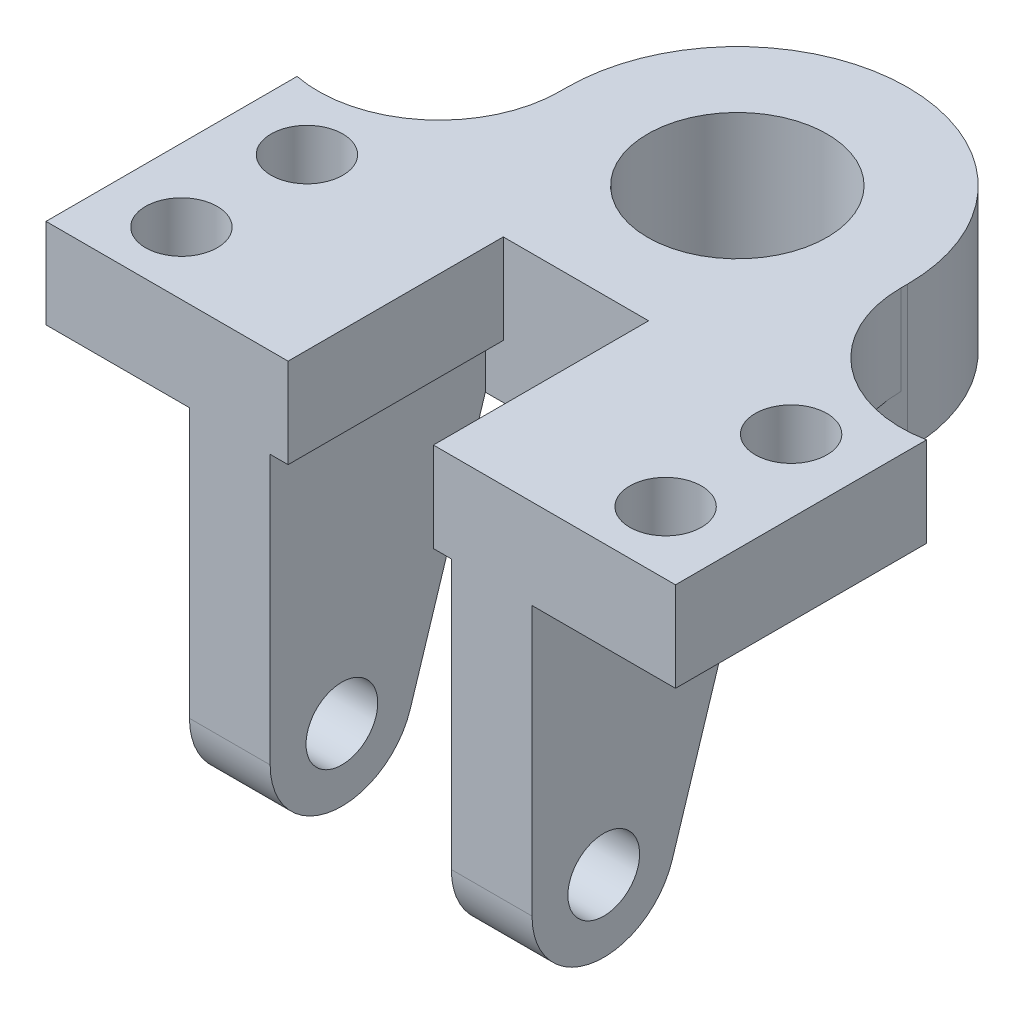
ISO-10303-21;
HEADER;
FILE_DESCRIPTION(('STEP AP214'),'2;1');
FILE_NAME('part.step','',(''),(''),'','','');
FILE_SCHEMA(('AUTOMOTIVE_DESIGN { 1 0 10303 214 1 1 1 1 }'));
ENDSEC;
DATA;
#1=APPLICATION_CONTEXT('core data for automotive mechanical design processes');
#2=APPLICATION_PROTOCOL_DEFINITION('international standard','automotive_design',2000,#1);
#3=PRODUCT_CONTEXT('',#1,'mechanical');
#4=PRODUCT('Part','Part','',(#3));
#5=PRODUCT_RELATED_PRODUCT_CATEGORY('part','',(#4));
#6=PRODUCT_DEFINITION_FORMATION('','',#4);
#7=PRODUCT_DEFINITION_CONTEXT('part definition',#1,'design');
#8=PRODUCT_DEFINITION('design','',#6,#7);
#9=PRODUCT_DEFINITION_SHAPE('','',#8);
#10=(LENGTH_UNIT() NAMED_UNIT(*) SI_UNIT(.MILLI.,.METRE.));
#11=(NAMED_UNIT(*) PLANE_ANGLE_UNIT() SI_UNIT($,.RADIAN.));
#12=(NAMED_UNIT(*) SI_UNIT($,.STERADIAN.) SOLID_ANGLE_UNIT());
#13=UNCERTAINTY_MEASURE_WITH_UNIT(LENGTH_MEASURE(1.E-05),#10,'distance_accuracy_value','');
#14=(GEOMETRIC_REPRESENTATION_CONTEXT(3) GLOBAL_UNCERTAINTY_ASSIGNED_CONTEXT((#13)) GLOBAL_UNIT_ASSIGNED_CONTEXT((#10,
#11,#12)) REPRESENTATION_CONTEXT('',''));
#15=CARTESIAN_POINT('',(0.,0.,0.));
#16=DIRECTION('',(0.,0.,1.));
#17=DIRECTION('',(1.,0.,0.));
#18=AXIS2_PLACEMENT_3D('',#15,#16,#17);
#19=CARTESIAN_POINT('',(-38.,32.,36.));
#20=DIRECTION('',(0.,0.,-1.));
#21=DIRECTION('',(-1.,0.,0.));
#22=AXIS2_PLACEMENT_3D('',#19,#20,#21);
#23=PLANE('',#22);
#24=DIRECTION('',(0.,-1.,0.));
#25=VECTOR('',#24,1.);
#26=CARTESIAN_POINT('',(-20.2057850301413,12.,36.));
#27=LINE('',#26,#25);
#28=CARTESIAN_POINT('',(-20.2057850301413,12.,36.));
#29=VERTEX_POINT('',#28);
#30=CARTESIAN_POINT('',(-20.2057850301413,0.,36.));
#31=VERTEX_POINT('',#30);
#32=EDGE_CURVE('E455',#29,#31,#27,.T.);
#33=ORIENTED_EDGE('',*,*,#32,.T.);
#34=DIRECTION('',(1.,0.,0.));
#35=VECTOR('',#34,1.);
#36=CARTESIAN_POINT('',(-38.,0.,36.));
#37=LINE('',#36,#35);
#38=CARTESIAN_POINT('',(20.2057850301413,0.,36.));
#39=VERTEX_POINT('',#38);
#40=EDGE_CURVE('E56',#31,#39,#37,.T.);
#41=ORIENTED_EDGE('',*,*,#40,.T.);
#42=DIRECTION('',(0.,-1.,0.));
#43=VECTOR('',#42,1.);
#44=CARTESIAN_POINT('',(20.2057850301413,12.,36.));
#45=LINE('',#44,#43);
#46=CARTESIAN_POINT('',(20.2057850301413,12.,36.));
#47=VERTEX_POINT('',#46);
#48=EDGE_CURVE('E235',#47,#39,#45,.T.);
#49=ORIENTED_EDGE('',*,*,#48,.F.);
#50=DIRECTION('',(1.,0.,0.));
#51=VECTOR('',#50,1.);
#52=CARTESIAN_POINT('',(38.,12.,36.));
#53=LINE('',#52,#51);
#54=CARTESIAN_POINT('',(16.2057850301413,12.,36.));
#55=VERTEX_POINT('',#54);
#56=EDGE_CURVE('E297',#55,#47,#53,.T.);
#57=ORIENTED_EDGE('',*,*,#56,.F.);
#58=DIRECTION('',(0.,1.,0.));
#59=VECTOR('',#58,1.);
#60=CARTESIAN_POINT('',(16.2057850301413,12.,36.));
#61=LINE('',#60,#59);
#62=CARTESIAN_POINT('',(16.2057850301413,32.,36.));
#63=VERTEX_POINT('',#62);
#64=EDGE_CURVE('E328',#55,#63,#61,.T.);
#65=ORIENTED_EDGE('',*,*,#64,.T.);
#66=DIRECTION('',(1.,0.,0.));
#67=VECTOR('',#66,1.);
#68=CARTESIAN_POINT('',(-38.,32.,36.));
#69=LINE('',#68,#67);
#70=CARTESIAN_POINT('',(-16.2057850301413,32.,36.));
#71=VERTEX_POINT('',#70);
#72=EDGE_CURVE('E397',#71,#63,#69,.T.);
#73=ORIENTED_EDGE('',*,*,#72,.F.);
#74=DIRECTION('',(0.,1.,0.));
#75=VECTOR('',#74,1.);
#76=CARTESIAN_POINT('',(-16.2057850301413,12.,36.));
#77=LINE('',#76,#75);
#78=CARTESIAN_POINT('',(-16.2057850301413,12.,36.));
#79=VERTEX_POINT('',#78);
#80=EDGE_CURVE('E375',#79,#71,#77,.T.);
#81=ORIENTED_EDGE('',*,*,#80,.F.);
#82=DIRECTION('',(-1.,0.,0.));
#83=VECTOR('',#82,1.);
#84=CARTESIAN_POINT('',(-38.,12.,36.));
#85=LINE('',#84,#83);
#86=EDGE_CURVE('E357',#79,#29,#85,.T.);
#87=ORIENTED_EDGE('',*,*,#86,.T.);
#88=EDGE_LOOP('',(#33,#41,#49,#57,#65,#73,#81,#87));
#89=FACE_BOUND('',#88,.T.);
#90=ADVANCED_FACE('F33',(#89),#23,.F.);
#91=CARTESIAN_POINT('',(-64.9900933310246,12.,1.51865377067885));
#92=DIRECTION('',(0.,1.,0.));
#93=DIRECTION('',(0.,0.,1.));
#94=AXIS2_PLACEMENT_3D('',#91,#92,#93);
#95=PLANE('',#94);
#96=DIRECTION('',(0.,0.,-1.));
#97=VECTOR('',#96,1.);
#98=CARTESIAN_POINT('',(-20.2057850301413,12.,36.));
#99=LINE('',#98,#97);
#100=CARTESIAN_POINT('',(-20.2057850301413,12.,84.));
#101=VERTEX_POINT('',#100);
#102=EDGE_CURVE('E48',#101,#29,#99,.T.);
#103=ORIENTED_EDGE('',*,*,#102,.T.);
#104=ORIENTED_EDGE('',*,*,#86,.F.);
#105=DIRECTION('',(0.,0.,-1.));
#106=VECTOR('',#105,1.);
#107=CARTESIAN_POINT('',(-16.2057850301413,12.,84.));
#108=LINE('',#107,#106);
#109=CARTESIAN_POINT('',(-16.2057850301413,12.,84.));
#110=VERTEX_POINT('',#109);
#111=EDGE_CURVE('E354',#110,#79,#108,.T.);
#112=ORIENTED_EDGE('',*,*,#111,.F.);
#113=DIRECTION('',(1.,0.,0.));
#114=VECTOR('',#113,1.);
#115=CARTESIAN_POINT('',(-38.2057850301413,12.,84.));
#116=LINE('',#115,#114);
#117=EDGE_CURVE('E351',#101,#110,#116,.T.);
#118=ORIENTED_EDGE('',*,*,#117,.F.);
#119=EDGE_LOOP('',(#103,#104,#112,#118));
#120=FACE_BOUND('',#119,.T.);
#121=ADVANCED_FACE('F457',(#120),#95,.F.);
#122=CARTESIAN_POINT('',(64.9900933310246,12.,1.51865377067885));
#123=DIRECTION('',(0.,1.,0.));
#124=DIRECTION('',(0.,0.,1.));
#125=AXIS2_PLACEMENT_3D('',#122,#123,#124);
#126=PLANE('',#125);
#127=DIRECTION('',(0.,0.,-1.));
#128=VECTOR('',#127,1.);
#129=CARTESIAN_POINT('',(20.2057850301413,12.,36.));
#130=LINE('',#129,#128);
#131=CARTESIAN_POINT('',(20.2057850301413,12.,84.));
#132=VERTEX_POINT('',#131);
#133=EDGE_CURVE('E243',#132,#47,#130,.T.);
#134=ORIENTED_EDGE('',*,*,#133,.F.);
#135=DIRECTION('',(-1.,0.,0.));
#136=VECTOR('',#135,1.);
#137=CARTESIAN_POINT('',(16.2057850301413,12.,84.));
#138=LINE('',#137,#136);
#139=CARTESIAN_POINT('',(16.2057850301413,12.,84.));
#140=VERTEX_POINT('',#139);
#141=EDGE_CURVE('E303',#132,#140,#138,.T.);
#142=ORIENTED_EDGE('',*,*,#141,.T.);
#143=DIRECTION('',(0.,0.,-1.));
#144=VECTOR('',#143,1.);
#145=CARTESIAN_POINT('',(16.2057850301413,12.,84.));
#146=LINE('',#145,#144);
#147=EDGE_CURVE('E300',#140,#55,#146,.T.);
#148=ORIENTED_EDGE('',*,*,#147,.T.);
#149=ORIENTED_EDGE('',*,*,#56,.T.);
#150=EDGE_LOOP('',(#134,#142,#148,#149));
#151=FACE_BOUND('',#150,.T.);
#152=ADVANCED_FACE('F437',(#151),#126,.F.);
#153=CARTESIAN_POINT('',(38.,32.,0.));
#154=DIRECTION('',(-1.,0.,0.));
#155=DIRECTION('',(0.,0.,1.));
#156=AXIS2_PLACEMENT_3D('',#153,#154,#155);
#157=PLANE('',#156);
#158=DIRECTION('',(0.,0.,-1.));
#159=VECTOR('',#158,1.);
#160=CARTESIAN_POINT('',(38.,12.,1.51865377067885));
#161=LINE('',#160,#159);
#162=CARTESIAN_POINT('',(38.,12.,36.));
#163=VERTEX_POINT('',#162);
#164=CARTESIAN_POINT('',(38.,12.,1.51865377067885));
#165=VERTEX_POINT('',#164);
#166=EDGE_CURVE('E293',#163,#165,#161,.T.);
#167=ORIENTED_EDGE('',*,*,#166,.F.);
#168=DIRECTION('',(0.,-1.,0.));
#169=VECTOR('',#168,1.);
#170=CARTESIAN_POINT('',(38.,32.,36.));
#171=LINE('',#170,#169);
#172=CARTESIAN_POINT('',(38.,0.,36.));
#173=VERTEX_POINT('',#172);
#174=EDGE_CURVE('E413',#163,#173,#171,.T.);
#175=ORIENTED_EDGE('',*,*,#174,.T.);
#176=DIRECTION('',(0.,0.,-1.));
#177=VECTOR('',#176,1.);
#178=CARTESIAN_POINT('',(38.,0.,0.));
#179=LINE('',#178,#177);
#180=CARTESIAN_POINT('',(38.,0.,0.));
#181=VERTEX_POINT('',#180);
#182=EDGE_CURVE('E394',#173,#181,#179,.T.);
#183=ORIENTED_EDGE('',*,*,#182,.T.);
#184=DIRECTION('',(0.,-1.,0.));
#185=VECTOR('',#184,1.);
#186=CARTESIAN_POINT('',(38.,32.,0.));
#187=LINE('',#186,#185);
#188=CARTESIAN_POINT('',(38.,32.,0.));
#189=VERTEX_POINT('',#188);
#190=EDGE_CURVE('E402',#189,#181,#187,.T.);
#191=ORIENTED_EDGE('',*,*,#190,.F.);
#192=DIRECTION('',(0.,0.,-1.));
#193=VECTOR('',#192,1.);
#194=CARTESIAN_POINT('',(38.,32.,0.));
#195=LINE('',#194,#193);
#196=CARTESIAN_POINT('',(38.,32.,1.51865377067885));
#197=VERTEX_POINT('',#196);
#198=EDGE_CURVE('E400',#197,#189,#195,.T.);
#199=ORIENTED_EDGE('',*,*,#198,.F.);
#200=DIRECTION('',(0.,1.,0.));
#201=VECTOR('',#200,1.);
#202=CARTESIAN_POINT('',(38.,12.,1.51865377067885));
#203=LINE('',#202,#201);
#204=EDGE_CURVE('E309',#165,#197,#203,.T.);
#205=ORIENTED_EDGE('',*,*,#204,.F.);
#206=EDGE_LOOP('',(#167,#175,#183,#191,#199,#205));
#207=FACE_BOUND('',#206,.T.);
#208=ADVANCED_FACE('F505',(#207),#157,.F.);
#209=CARTESIAN_POINT('',(-38.,32.,36.));
#210=DIRECTION('',(1.,0.,0.));
#211=DIRECTION('',(0.,0.,-1.));
#212=AXIS2_PLACEMENT_3D('',#209,#210,#211);
#213=PLANE('',#212);
#214=DIRECTION('',(0.,1.,0.));
#215=VECTOR('',#214,1.);
#216=CARTESIAN_POINT('',(-38.,12.,1.51865377067885));
#217=LINE('',#216,#215);
#218=CARTESIAN_POINT('',(-38.,12.,1.51865377067885));
#219=VERTEX_POINT('',#218);
#220=CARTESIAN_POINT('',(-38.,32.,1.51865377067885));
#221=VERTEX_POINT('',#220);
#222=EDGE_CURVE('E371',#219,#221,#217,.T.);
#223=ORIENTED_EDGE('',*,*,#222,.T.);
#224=DIRECTION('',(0.,0.,1.));
#225=VECTOR('',#224,1.);
#226=CARTESIAN_POINT('',(-38.,32.,36.));
#227=LINE('',#226,#225);
#228=CARTESIAN_POINT('',(-38.,32.,0.));
#229=VERTEX_POINT('',#228);
#230=EDGE_CURVE('E393',#229,#221,#227,.T.);
#231=ORIENTED_EDGE('',*,*,#230,.F.);
#232=DIRECTION('',(0.,-1.,0.));
#233=VECTOR('',#232,1.);
#234=CARTESIAN_POINT('',(-38.,32.,0.));
#235=LINE('',#234,#233);
#236=CARTESIAN_POINT('',(-38.,0.,0.));
#237=VERTEX_POINT('',#236);
#238=EDGE_CURVE('E11',#229,#237,#235,.T.);
#239=ORIENTED_EDGE('',*,*,#238,.T.);
#240=DIRECTION('',(0.,0.,1.));
#241=VECTOR('',#240,1.);
#242=CARTESIAN_POINT('',(-38.,0.,36.));
#243=LINE('',#242,#241);
#244=CARTESIAN_POINT('',(-38.,0.,36.));
#245=VERTEX_POINT('',#244);
#246=EDGE_CURVE('E405',#237,#245,#243,.T.);
#247=ORIENTED_EDGE('',*,*,#246,.T.);
#248=DIRECTION('',(0.,-1.,0.));
#249=VECTOR('',#248,1.);
#250=CARTESIAN_POINT('',(-38.,32.,36.));
#251=LINE('',#250,#249);
#252=CARTESIAN_POINT('',(-38.,12.,36.));
#253=VERTEX_POINT('',#252);
#254=EDGE_CURVE('E41',#253,#245,#251,.T.);
#255=ORIENTED_EDGE('',*,*,#254,.F.);
#256=DIRECTION('',(0.,0.,-1.));
#257=VECTOR('',#256,1.);
#258=CARTESIAN_POINT('',(-38.,12.,1.51865377067885));
#259=LINE('',#258,#257);
#260=EDGE_CURVE('E220',#253,#219,#259,.T.);
#261=ORIENTED_EDGE('',*,*,#260,.T.);
#262=EDGE_LOOP('',(#223,#231,#239,#247,#255,#261));
#263=FACE_BOUND('',#262,.T.);
#264=ADVANCED_FACE('F421',(#263),#213,.F.);
#265=CARTESIAN_POINT('',(0.,32.,0.));
#266=DIRECTION('',(0.,1.,0.));
#267=DIRECTION('',(0.,0.,1.));
#268=AXIS2_PLACEMENT_3D('',#265,#266,#267);
#269=PLANE('',#268);
#270=ORIENTED_EDGE('',*,*,#230,.T.);
#271=CARTESIAN_POINT('',(-64.9900933310246,32.,1.51865377067885));
#272=DIRECTION('',(0.,-1.,0.));
#273=DIRECTION('',(0.,0.,1.));
#274=AXIS2_PLACEMENT_3D('',#271,#272,#273);
#275=CIRCLE('',#274,26.9900933310246);
#276=CARTESIAN_POINT('',(-70.2057850301414,32.,28.));
#277=VERTEX_POINT('',#276);
#278=EDGE_CURVE('E341',#221,#277,#275,.T.);
#279=ORIENTED_EDGE('',*,*,#278,.T.);
#280=DIRECTION('',(0.,0.,1.));
#281=VECTOR('',#280,1.);
#282=CARTESIAN_POINT('',(-70.2057850301414,32.,84.));
#283=LINE('',#282,#281);
#284=CARTESIAN_POINT('',(-70.2057850301414,32.,84.));
#285=VERTEX_POINT('',#284);
#286=EDGE_CURVE('E364',#277,#285,#283,.T.);
#287=ORIENTED_EDGE('',*,*,#286,.T.);
#288=DIRECTION('',(1.,0.,0.));
#289=VECTOR('',#288,1.);
#290=CARTESIAN_POINT('',(-16.2057850301413,32.,84.));
#291=LINE('',#290,#289);
#292=CARTESIAN_POINT('',(-16.2057850301413,32.,84.));
#293=VERTEX_POINT('',#292);
#294=EDGE_CURVE('E367',#285,#293,#291,.T.);
#295=ORIENTED_EDGE('',*,*,#294,.T.);
#296=DIRECTION('',(0.,0.,-1.));
#297=VECTOR('',#296,1.);
#298=CARTESIAN_POINT('',(-16.2057850301413,32.,84.));
#299=LINE('',#298,#297);
#300=EDGE_CURVE('E348',#293,#71,#299,.T.);
#301=ORIENTED_EDGE('',*,*,#300,.T.);
#302=ORIENTED_EDGE('',*,*,#72,.T.);
#303=DIRECTION('',(0.,0.,-1.));
#304=VECTOR('',#303,1.);
#305=CARTESIAN_POINT('',(16.2057850301413,32.,84.));
#306=LINE('',#305,#304);
#307=CARTESIAN_POINT('',(16.2057850301413,32.,84.));
#308=VERTEX_POINT('',#307);
#309=EDGE_CURVE('E312',#308,#63,#306,.T.);
#310=ORIENTED_EDGE('',*,*,#309,.F.);
#311=DIRECTION('',(-1.,0.,0.));
#312=VECTOR('',#311,1.);
#313=CARTESIAN_POINT('',(38.2057850301413,32.,84.));
#314=LINE('',#313,#312);
#315=CARTESIAN_POINT('',(70.2057850301414,32.,84.));
#316=VERTEX_POINT('',#315);
#317=EDGE_CURVE('E315',#316,#308,#314,.T.);
#318=ORIENTED_EDGE('',*,*,#317,.F.);
#319=DIRECTION('',(0.,0.,1.));
#320=VECTOR('',#319,1.);
#321=CARTESIAN_POINT('',(70.2057850301414,32.,84.));
#322=LINE('',#321,#320);
#323=CARTESIAN_POINT('',(70.2057850301414,32.,28.));
#324=VERTEX_POINT('',#323);
#325=EDGE_CURVE('E294',#324,#316,#322,.T.);
#326=ORIENTED_EDGE('',*,*,#325,.F.);
#327=CARTESIAN_POINT('',(64.9900933310246,32.,1.51865377067885));
#328=DIRECTION('',(0.,1.,0.));
#329=DIRECTION('',(0.,0.,1.));
#330=AXIS2_PLACEMENT_3D('',#327,#328,#329);
#331=CIRCLE('',#330,26.9900933310246);
#332=EDGE_CURVE('E287',#197,#324,#331,.T.);
#333=ORIENTED_EDGE('',*,*,#332,.F.);
#334=ORIENTED_EDGE('',*,*,#198,.T.);
#335=CARTESIAN_POINT('',(0.,32.,0.));
#336=DIRECTION('',(0.,1.,0.));
#337=DIRECTION('',(0.,0.,1.));
#338=AXIS2_PLACEMENT_3D('',#335,#336,#337);
#339=CIRCLE('',#338,38.);
#340=EDGE_CURVE('E390',#189,#229,#339,.T.);
#341=ORIENTED_EDGE('',*,*,#340,.T.);
#342=EDGE_LOOP('',(#270,#279,#287,#295,#301,#302,#310,#318,#326,#333,#334,#341));
#343=FACE_BOUND('',#342,.T.);
#344=CARTESIAN_POINT('',(0.,32.,0.));
#345=DIRECTION('',(0.,1.,0.));
#346=DIRECTION('',(0.,0.,1.));
#347=AXIS2_PLACEMENT_3D('',#344,#345,#346);
#348=CIRCLE('',#347,20.);
#349=CARTESIAN_POINT('',(0.,32.,20.));
#350=VERTEX_POINT('',#349);
#351=EDGE_CURVE('E384',#350,#350,#348,.T.);
#352=ORIENTED_EDGE('',*,*,#351,.F.);
#353=EDGE_LOOP('',(#352));
#354=FACE_BOUND('',#353,.T.);
#355=CARTESIAN_POINT('',(-54.,32.,70.));
#356=DIRECTION('',(0.,1.,0.));
#357=DIRECTION('',(0.,0.,1.));
#358=AXIS2_PLACEMENT_3D('',#355,#356,#357);
#359=CIRCLE('',#358,7.99999999999999);
#360=CARTESIAN_POINT('',(-54.,32.,78.));
#361=VERTEX_POINT('',#360);
#362=EDGE_CURVE('E321',#361,#361,#359,.T.);
#363=ORIENTED_EDGE('',*,*,#362,.F.);
#364=EDGE_LOOP('',(#363));
#365=FACE_BOUND('',#364,.T.);
#366=CARTESIAN_POINT('',(-54.,32.,42.));
#367=DIRECTION('',(0.,1.,0.));
#368=DIRECTION('',(0.,0.,1.));
#369=AXIS2_PLACEMENT_3D('',#366,#367,#368);
#370=CIRCLE('',#369,8.00000000000001);
#371=CARTESIAN_POINT('',(-54.,32.,50.));
#372=VERTEX_POINT('',#371);
#373=EDGE_CURVE('E335',#372,#372,#370,.T.);
#374=ORIENTED_EDGE('',*,*,#373,.F.);
#375=EDGE_LOOP('',(#374));
#376=FACE_BOUND('',#375,.T.);
#377=CARTESIAN_POINT('',(54.,32.,42.));
#378=DIRECTION('',(0.,-1.,0.));
#379=DIRECTION('',(0.,0.,1.));
#380=AXIS2_PLACEMENT_3D('',#377,#378,#379);
#381=CIRCLE('',#380,8.00000000000001);
#382=CARTESIAN_POINT('',(54.,32.,50.));
#383=VERTEX_POINT('',#382);
#384=EDGE_CURVE('E281',#383,#383,#381,.T.);
#385=ORIENTED_EDGE('',*,*,#384,.T.);
#386=EDGE_LOOP('',(#385));
#387=FACE_BOUND('',#386,.T.);
#388=CARTESIAN_POINT('',(54.,32.,70.));
#389=DIRECTION('',(0.,-1.,0.));
#390=DIRECTION('',(0.,0.,1.));
#391=AXIS2_PLACEMENT_3D('',#388,#389,#390);
#392=CIRCLE('',#391,7.99999999999999);
#393=CARTESIAN_POINT('',(54.,32.,78.));
#394=VERTEX_POINT('',#393);
#395=EDGE_CURVE('E270',#394,#394,#392,.T.);
#396=ORIENTED_EDGE('',*,*,#395,.T.);
#397=EDGE_LOOP('',(#396));
#398=FACE_BOUND('',#397,.T.);
#399=ADVANCED_FACE('F447',(#343,#354,#365,#376,#387,#398),#269,.T.);
#400=CARTESIAN_POINT('',(0.,0.,0.));
#401=DIRECTION('',(0.,1.,0.));
#402=DIRECTION('',(0.,0.,1.));
#403=AXIS2_PLACEMENT_3D('',#400,#401,#402);
#404=PLANE('',#403);
#405=CARTESIAN_POINT('',(0.,0.,0.));
#406=DIRECTION('',(0.,1.,0.));
#407=DIRECTION('',(0.,0.,1.));
#408=AXIS2_PLACEMENT_3D('',#405,#406,#407);
#409=CIRCLE('',#408,38.);
#410=EDGE_CURVE('E387',#181,#237,#409,.T.);
#411=ORIENTED_EDGE('',*,*,#410,.F.);
#412=ORIENTED_EDGE('',*,*,#182,.F.);
#413=DIRECTION('',(-1.,0.,0.));
#414=VECTOR('',#413,1.);
#415=CARTESIAN_POINT('',(38.2057850301413,0.,36.));
#416=LINE('',#415,#414);
#417=EDGE_CURVE('E254',#173,#39,#416,.T.);
#418=ORIENTED_EDGE('',*,*,#417,.T.);
#419=ORIENTED_EDGE('',*,*,#40,.F.);
#420=EDGE_CURVE('E408',#245,#31,#37,.T.);
#421=ORIENTED_EDGE('',*,*,#420,.F.);
#422=ORIENTED_EDGE('',*,*,#246,.F.);
#423=EDGE_LOOP('',(#411,#412,#418,#419,#421,#422));
#424=FACE_BOUND('',#423,.T.);
#425=CARTESIAN_POINT('',(0.,0.,0.));
#426=DIRECTION('',(0.,1.,0.));
#427=DIRECTION('',(0.,0.,1.));
#428=AXIS2_PLACEMENT_3D('',#425,#426,#427);
#429=CIRCLE('',#428,20.);
#430=CARTESIAN_POINT('',(0.,0.,20.));
#431=VERTEX_POINT('',#430);
#432=EDGE_CURVE('E374',#431,#431,#429,.T.);
#433=ORIENTED_EDGE('',*,*,#432,.T.);
#434=EDGE_LOOP('',(#433));
#435=FACE_BOUND('',#434,.T.);
#436=ADVANCED_FACE('F425',(#424,#435),#404,.F.);
#437=CARTESIAN_POINT('',(0.,32.,0.));
#438=DIRECTION('',(0.,-1.,0.));
#439=DIRECTION('',(0.,0.,-1.));
#440=AXIS2_PLACEMENT_3D('',#437,#438,#439);
#441=CYLINDRICAL_SURFACE('',#440,38.);
#442=ORIENTED_EDGE('',*,*,#410,.T.);
#443=ORIENTED_EDGE('',*,*,#238,.F.);
#444=ORIENTED_EDGE('',*,*,#340,.F.);
#445=ORIENTED_EDGE('',*,*,#190,.T.);
#446=EDGE_LOOP('',(#442,#443,#444,#445));
#447=FACE_BOUND('',#446,.T.);
#448=ADVANCED_FACE('F35',(#447),#441,.T.);
#449=CARTESIAN_POINT('',(0.,32.,0.));
#450=DIRECTION('',(0.,-1.,0.));
#451=DIRECTION('',(0.,0.,-1.));
#452=AXIS2_PLACEMENT_3D('',#449,#450,#451);
#453=CYLINDRICAL_SURFACE('',#452,20.);
#454=ORIENTED_EDGE('',*,*,#351,.T.);
#455=EDGE_LOOP('',(#454));
#456=FACE_BOUND('',#455,.T.);
#457=ORIENTED_EDGE('',*,*,#432,.F.);
#458=EDGE_LOOP('',(#457));
#459=FACE_BOUND('',#458,.T.);
#460=ADVANCED_FACE('F596',(#456,#459),#453,.F.);
#461=CARTESIAN_POINT('',(-64.9900933310246,12.,1.51865377067885));
#462=DIRECTION('',(0.,1.,0.));
#463=DIRECTION('',(0.,0.,1.));
#464=AXIS2_PLACEMENT_3D('',#461,#462,#463);
#465=CYLINDRICAL_SURFACE('',#464,26.9900933310246);
#466=ORIENTED_EDGE('',*,*,#278,.F.);
#467=ORIENTED_EDGE('',*,*,#222,.F.);
#468=CARTESIAN_POINT('',(-64.9900933310246,12.,1.51865377067885));
#469=DIRECTION('',(0.,-1.,0.));
#470=DIRECTION('',(0.,0.,1.));
#471=AXIS2_PLACEMENT_3D('',#468,#469,#470);
#472=CIRCLE('',#471,26.9900933310246);
#473=CARTESIAN_POINT('',(-70.2057850301414,12.,28.));
#474=VERTEX_POINT('',#473);
#475=EDGE_CURVE('E344',#219,#474,#472,.T.);
#476=ORIENTED_EDGE('',*,*,#475,.T.);
#477=DIRECTION('',(0.,1.,0.));
#478=VECTOR('',#477,1.);
#479=CARTESIAN_POINT('',(-70.2057850301414,12.,28.));
#480=LINE('',#479,#478);
#481=EDGE_CURVE('E361',#474,#277,#480,.T.);
#482=ORIENTED_EDGE('',*,*,#481,.T.);
#483=EDGE_LOOP('',(#466,#467,#476,#482));
#484=FACE_BOUND('',#483,.T.);
#485=ADVANCED_FACE('F588',(#484),#465,.F.);
#486=CARTESIAN_POINT('',(-16.2057850301413,12.,84.));
#487=DIRECTION('',(1.,0.,0.));
#488=DIRECTION('',(0.,0.,-1.));
#489=AXIS2_PLACEMENT_3D('',#486,#487,#488);
#490=PLANE('',#489);
#491=ORIENTED_EDGE('',*,*,#300,.F.);
#492=DIRECTION('',(0.,1.,0.));
#493=VECTOR('',#492,1.);
#494=CARTESIAN_POINT('',(-16.2057850301413,12.,84.));
#495=LINE('',#494,#493);
#496=EDGE_CURVE('E378',#110,#293,#495,.T.);
#497=ORIENTED_EDGE('',*,*,#496,.F.);
#498=ORIENTED_EDGE('',*,*,#111,.T.);
#499=ORIENTED_EDGE('',*,*,#80,.T.);
#500=EDGE_LOOP('',(#491,#497,#498,#499));
#501=FACE_BOUND('',#500,.T.);
#502=ADVANCED_FACE('F453',(#501),#490,.T.);
#503=CARTESIAN_POINT('',(-16.2057850301413,12.,84.));
#504=DIRECTION('',(0.,0.,1.));
#505=DIRECTION('',(1.,0.,0.));
#506=AXIS2_PLACEMENT_3D('',#503,#504,#505);
#507=PLANE('',#506);
#508=ORIENTED_EDGE('',*,*,#294,.F.);
#509=DIRECTION('',(0.,1.,0.));
#510=VECTOR('',#509,1.);
#511=CARTESIAN_POINT('',(-70.2057850301414,12.,84.));
#512=LINE('',#511,#510);
#513=CARTESIAN_POINT('',(-70.2057850301414,12.,84.));
#514=VERTEX_POINT('',#513);
#515=EDGE_CURVE('E380',#514,#285,#512,.T.);
#516=ORIENTED_EDGE('',*,*,#515,.F.);
#517=CARTESIAN_POINT('',(-38.2057850301413,12.,84.));
#518=VERTEX_POINT('',#517);
#519=EDGE_CURVE('E352',#514,#518,#116,.T.);
#520=ORIENTED_EDGE('',*,*,#519,.T.);
#521=DIRECTION('',(0.,1.,0.));
#522=VECTOR('',#521,1.);
#523=CARTESIAN_POINT('',(-38.2057850301413,12.,84.));
#524=LINE('',#523,#522);
#525=CARTESIAN_POINT('',(-38.2057850301413,-48.,84.));
#526=VERTEX_POINT('',#525);
#527=EDGE_CURVE('E203',#526,#518,#524,.T.);
#528=ORIENTED_EDGE('',*,*,#527,.F.);
#529=DIRECTION('',(1.,0.,0.));
#530=VECTOR('',#529,1.);
#531=CARTESIAN_POINT('',(-38.2057850301413,-48.,84.));
#532=LINE('',#531,#530);
#533=CARTESIAN_POINT('',(-20.2057850301413,-48.,84.));
#534=VERTEX_POINT('',#533);
#535=EDGE_CURVE('E222',#526,#534,#532,.T.);
#536=ORIENTED_EDGE('',*,*,#535,.T.);
#537=DIRECTION('',(0.,1.,0.));
#538=VECTOR('',#537,1.);
#539=CARTESIAN_POINT('',(-20.2057850301413,12.,84.));
#540=LINE('',#539,#538);
#541=EDGE_CURVE('E459',#534,#101,#540,.T.);
#542=ORIENTED_EDGE('',*,*,#541,.T.);
#543=ORIENTED_EDGE('',*,*,#117,.T.);
#544=ORIENTED_EDGE('',*,*,#496,.T.);
#545=EDGE_LOOP('',(#508,#516,#520,#528,#536,#542,#543,#544));
#546=FACE_BOUND('',#545,.T.);
#547=ADVANCED_FACE('F476',(#546),#507,.T.);
#548=CARTESIAN_POINT('',(-70.2057850301414,12.,84.));
#549=DIRECTION('',(-1.,0.,0.));
#550=DIRECTION('',(0.,0.,1.));
#551=AXIS2_PLACEMENT_3D('',#548,#549,#550);
#552=PLANE('',#551);
#553=ORIENTED_EDGE('',*,*,#286,.F.);
#554=ORIENTED_EDGE('',*,*,#481,.F.);
#555=DIRECTION('',(0.,0.,1.));
#556=VECTOR('',#555,1.);
#557=CARTESIAN_POINT('',(-70.2057850301414,12.,84.));
#558=LINE('',#557,#556);
#559=EDGE_CURVE('E347',#474,#514,#558,.T.);
#560=ORIENTED_EDGE('',*,*,#559,.T.);
#561=ORIENTED_EDGE('',*,*,#515,.T.);
#562=EDGE_LOOP('',(#553,#554,#560,#561));
#563=FACE_BOUND('',#562,.T.);
#564=ADVANCED_FACE('F584',(#563),#552,.T.);
#565=CARTESIAN_POINT('',(-54.,12.,70.));
#566=DIRECTION('',(0.,1.,0.));
#567=DIRECTION('',(0.,0.,1.));
#568=AXIS2_PLACEMENT_3D('',#565,#566,#567);
#569=CIRCLE('',#568,7.99999999999999);
#570=CARTESIAN_POINT('',(-54.,12.,78.));
#571=VERTEX_POINT('',#570);
#572=EDGE_CURVE('E332',#571,#571,#569,.T.);
#573=ORIENTED_EDGE('',*,*,#572,.T.);
#574=EDGE_LOOP('',(#573));
#575=FACE_BOUND('',#574,.T.);
#576=CARTESIAN_POINT('',(-54.,12.,42.));
#577=DIRECTION('',(0.,1.,0.));
#578=DIRECTION('',(0.,0.,1.));
#579=AXIS2_PLACEMENT_3D('',#576,#577,#578);
#580=CIRCLE('',#579,8.00000000000001);
#581=CARTESIAN_POINT('',(-54.,12.,50.));
#582=VERTEX_POINT('',#581);
#583=EDGE_CURVE('E338',#582,#582,#580,.T.);
#584=ORIENTED_EDGE('',*,*,#583,.T.);
#585=EDGE_LOOP('',(#584));
#586=FACE_BOUND('',#585,.T.);
#587=DIRECTION('',(1.,0.,0.));
#588=VECTOR('',#587,1.);
#589=CARTESIAN_POINT('',(-38.2057850301413,12.,36.));
#590=LINE('',#589,#588);
#591=CARTESIAN_POINT('',(-38.2057850301413,12.,36.));
#592=VERTEX_POINT('',#591);
#593=EDGE_CURVE('E211',#592,#253,#590,.T.);
#594=ORIENTED_EDGE('',*,*,#593,.F.);
#595=DIRECTION('',(0.,0.,-1.));
#596=VECTOR('',#595,1.);
#597=CARTESIAN_POINT('',(-38.2057850301413,12.,36.));
#598=LINE('',#597,#596);
#599=EDGE_CURVE('E196',#518,#592,#598,.T.);
#600=ORIENTED_EDGE('',*,*,#599,.F.);
#601=ORIENTED_EDGE('',*,*,#519,.F.);
#602=ORIENTED_EDGE('',*,*,#559,.F.);
#603=ORIENTED_EDGE('',*,*,#475,.F.);
#604=ORIENTED_EDGE('',*,*,#260,.F.);
#605=EDGE_LOOP('',(#594,#600,#601,#602,#603,#604));
#606=FACE_BOUND('',#605,.T.);
#607=ADVANCED_FACE('F217',(#575,#586,#606),#95,.F.);
#608=CARTESIAN_POINT('',(-54.,12.,42.));
#609=DIRECTION('',(0.,1.,0.));
#610=DIRECTION('',(0.,0.,1.));
#611=AXIS2_PLACEMENT_3D('',#608,#609,#610);
#612=CYLINDRICAL_SURFACE('',#611,8.00000000000001);
#613=ORIENTED_EDGE('',*,*,#583,.F.);
#614=EDGE_LOOP('',(#613));
#615=FACE_BOUND('',#614,.T.);
#616=ORIENTED_EDGE('',*,*,#373,.T.);
#617=EDGE_LOOP('',(#616));
#618=FACE_BOUND('',#617,.T.);
#619=ADVANCED_FACE('F578',(#615,#618),#612,.F.);
#620=CARTESIAN_POINT('',(-54.,12.,70.));
#621=DIRECTION('',(0.,1.,0.));
#622=DIRECTION('',(0.,0.,1.));
#623=AXIS2_PLACEMENT_3D('',#620,#621,#622);
#624=CYLINDRICAL_SURFACE('',#623,7.99999999999999);
#625=ORIENTED_EDGE('',*,*,#572,.F.);
#626=EDGE_LOOP('',(#625));
#627=FACE_BOUND('',#626,.T.);
#628=ORIENTED_EDGE('',*,*,#362,.T.);
#629=EDGE_LOOP('',(#628));
#630=FACE_BOUND('',#629,.T.);
#631=ADVANCED_FACE('F547',(#627,#630),#624,.F.);
#632=DIRECTION('',(0.,0.,-1.));
#633=VECTOR('',#632,1.);
#634=CARTESIAN_POINT('',(38.2057850301413,12.,36.));
#635=LINE('',#634,#633);
#636=CARTESIAN_POINT('',(38.2057850301413,12.,84.));
#637=VERTEX_POINT('',#636);
#638=CARTESIAN_POINT('',(38.2057850301413,12.,36.));
#639=VERTEX_POINT('',#638);
#640=EDGE_CURVE('E252',#637,#639,#635,.T.);
#641=ORIENTED_EDGE('',*,*,#640,.T.);
#642=DIRECTION('',(-1.,0.,0.));
#643=VECTOR('',#642,1.);
#644=CARTESIAN_POINT('',(38.2057850301413,12.,36.));
#645=LINE('',#644,#643);
#646=EDGE_CURVE('E268',#639,#163,#645,.T.);
#647=ORIENTED_EDGE('',*,*,#646,.T.);
#648=ORIENTED_EDGE('',*,*,#166,.T.);
#649=CARTESIAN_POINT('',(64.9900933310246,12.,1.51865377067885));
#650=DIRECTION('',(0.,1.,0.));
#651=DIRECTION('',(0.,0.,1.));
#652=AXIS2_PLACEMENT_3D('',#649,#650,#651);
#653=CIRCLE('',#652,26.9900933310246);
#654=CARTESIAN_POINT('',(70.2057850301414,12.,28.));
#655=VERTEX_POINT('',#654);
#656=EDGE_CURVE('E290',#165,#655,#653,.T.);
#657=ORIENTED_EDGE('',*,*,#656,.T.);
#658=DIRECTION('',(0.,0.,1.));
#659=VECTOR('',#658,1.);
#660=CARTESIAN_POINT('',(70.2057850301414,12.,84.));
#661=LINE('',#660,#659);
#662=CARTESIAN_POINT('',(70.2057850301414,12.,84.));
#663=VERTEX_POINT('',#662);
#664=EDGE_CURVE('E306',#655,#663,#661,.T.);
#665=ORIENTED_EDGE('',*,*,#664,.T.);
#666=EDGE_CURVE('E304',#663,#637,#138,.T.);
#667=ORIENTED_EDGE('',*,*,#666,.T.);
#668=EDGE_LOOP('',(#641,#647,#648,#657,#665,#667));
#669=FACE_BOUND('',#668,.T.);
#670=CARTESIAN_POINT('',(54.,12.,42.));
#671=DIRECTION('',(0.,-1.,0.));
#672=DIRECTION('',(0.,0.,1.));
#673=AXIS2_PLACEMENT_3D('',#670,#671,#672);
#674=CIRCLE('',#673,8.00000000000001);
#675=CARTESIAN_POINT('',(54.,12.,50.));
#676=VERTEX_POINT('',#675);
#677=EDGE_CURVE('E284',#676,#676,#674,.T.);
#678=ORIENTED_EDGE('',*,*,#677,.F.);
#679=EDGE_LOOP('',(#678));
#680=FACE_BOUND('',#679,.T.);
#681=CARTESIAN_POINT('',(54.,12.,70.));
#682=DIRECTION('',(0.,-1.,0.));
#683=DIRECTION('',(0.,0.,1.));
#684=AXIS2_PLACEMENT_3D('',#681,#682,#683);
#685=CIRCLE('',#684,7.99999999999999);
#686=CARTESIAN_POINT('',(54.,12.,78.));
#687=VERTEX_POINT('',#686);
#688=EDGE_CURVE('E278',#687,#687,#685,.T.);
#689=ORIENTED_EDGE('',*,*,#688,.F.);
#690=EDGE_LOOP('',(#689));
#691=FACE_BOUND('',#690,.T.);
#692=ADVANCED_FACE('F518',(#669,#680,#691),#126,.F.);
#693=CARTESIAN_POINT('',(64.9900933310246,12.,1.51865377067885));
#694=DIRECTION('',(0.,1.,0.));
#695=DIRECTION('',(0.,0.,1.));
#696=AXIS2_PLACEMENT_3D('',#693,#694,#695);
#697=CYLINDRICAL_SURFACE('',#696,26.9900933310246);
#698=ORIENTED_EDGE('',*,*,#332,.T.);
#699=DIRECTION('',(0.,1.,0.));
#700=VECTOR('',#699,1.);
#701=CARTESIAN_POINT('',(70.2057850301414,12.,28.));
#702=LINE('',#701,#700);
#703=EDGE_CURVE('E318',#655,#324,#702,.T.);
#704=ORIENTED_EDGE('',*,*,#703,.F.);
#705=ORIENTED_EDGE('',*,*,#656,.F.);
#706=ORIENTED_EDGE('',*,*,#204,.T.);
#707=EDGE_LOOP('',(#698,#704,#705,#706));
#708=FACE_BOUND('',#707,.T.);
#709=ADVANCED_FACE('F544',(#708),#697,.F.);
#710=CARTESIAN_POINT('',(70.2057850301414,12.,84.));
#711=DIRECTION('',(-1.,0.,0.));
#712=DIRECTION('',(0.,0.,1.));
#713=AXIS2_PLACEMENT_3D('',#710,#711,#712);
#714=PLANE('',#713);
#715=ORIENTED_EDGE('',*,*,#325,.T.);
#716=DIRECTION('',(0.,1.,0.));
#717=VECTOR('',#716,1.);
#718=CARTESIAN_POINT('',(70.2057850301414,12.,84.));
#719=LINE('',#718,#717);
#720=EDGE_CURVE('E322',#663,#316,#719,.T.);
#721=ORIENTED_EDGE('',*,*,#720,.F.);
#722=ORIENTED_EDGE('',*,*,#664,.F.);
#723=ORIENTED_EDGE('',*,*,#703,.T.);
#724=EDGE_LOOP('',(#715,#721,#722,#723));
#725=FACE_BOUND('',#724,.T.);
#726=ADVANCED_FACE('F542',(#725),#714,.F.);
#727=CARTESIAN_POINT('',(38.2057850301413,12.,84.));
#728=DIRECTION('',(0.,0.,-1.));
#729=DIRECTION('',(-1.,0.,0.));
#730=AXIS2_PLACEMENT_3D('',#727,#728,#729);
#731=PLANE('',#730);
#732=ORIENTED_EDGE('',*,*,#317,.T.);
#733=DIRECTION('',(0.,1.,0.));
#734=VECTOR('',#733,1.);
#735=CARTESIAN_POINT('',(16.2057850301413,12.,84.));
#736=LINE('',#735,#734);
#737=EDGE_CURVE('E325',#140,#308,#736,.T.);
#738=ORIENTED_EDGE('',*,*,#737,.F.);
#739=ORIENTED_EDGE('',*,*,#141,.F.);
#740=DIRECTION('',(0.,1.,0.));
#741=VECTOR('',#740,1.);
#742=CARTESIAN_POINT('',(20.2057850301413,12.,84.));
#743=LINE('',#742,#741);
#744=CARTESIAN_POINT('',(20.2057850301413,-48.,84.));
#745=VERTEX_POINT('',#744);
#746=EDGE_CURVE('E263',#745,#132,#743,.T.);
#747=ORIENTED_EDGE('',*,*,#746,.F.);
#748=DIRECTION('',(-1.,0.,0.));
#749=VECTOR('',#748,1.);
#750=CARTESIAN_POINT('',(38.2057850301413,-48.,84.));
#751=LINE('',#750,#749);
#752=CARTESIAN_POINT('',(38.2057850301413,-48.,84.));
#753=VERTEX_POINT('',#752);
#754=EDGE_CURVE('E271',#753,#745,#751,.T.);
#755=ORIENTED_EDGE('',*,*,#754,.F.);
#756=DIRECTION('',(0.,1.,0.));
#757=VECTOR('',#756,1.);
#758=CARTESIAN_POINT('',(38.2057850301413,12.,84.));
#759=LINE('',#758,#757);
#760=EDGE_CURVE('E249',#753,#637,#759,.T.);
#761=ORIENTED_EDGE('',*,*,#760,.T.);
#762=ORIENTED_EDGE('',*,*,#666,.F.);
#763=ORIENTED_EDGE('',*,*,#720,.T.);
#764=EDGE_LOOP('',(#732,#738,#739,#747,#755,#761,#762,#763));
#765=FACE_BOUND('',#764,.T.);
#766=ADVANCED_FACE('F537',(#765),#731,.F.);
#767=CARTESIAN_POINT('',(16.2057850301413,12.,84.));
#768=DIRECTION('',(1.,0.,0.));
#769=DIRECTION('',(0.,0.,-1.));
#770=AXIS2_PLACEMENT_3D('',#767,#768,#769);
#771=PLANE('',#770);
#772=ORIENTED_EDGE('',*,*,#309,.T.);
#773=ORIENTED_EDGE('',*,*,#64,.F.);
#774=ORIENTED_EDGE('',*,*,#147,.F.);
#775=ORIENTED_EDGE('',*,*,#737,.T.);
#776=EDGE_LOOP('',(#772,#773,#774,#775));
#777=FACE_BOUND('',#776,.T.);
#778=ADVANCED_FACE('F442',(#777),#771,.F.);
#779=CARTESIAN_POINT('',(54.,12.,42.));
#780=DIRECTION('',(0.,1.,0.));
#781=DIRECTION('',(0.,0.,1.));
#782=AXIS2_PLACEMENT_3D('',#779,#780,#781);
#783=CYLINDRICAL_SURFACE('',#782,8.00000000000001);
#784=ORIENTED_EDGE('',*,*,#677,.T.);
#785=EDGE_LOOP('',(#784));
#786=FACE_BOUND('',#785,.T.);
#787=ORIENTED_EDGE('',*,*,#384,.F.);
#788=EDGE_LOOP('',(#787));
#789=FACE_BOUND('',#788,.T.);
#790=ADVANCED_FACE('F555',(#786,#789),#783,.F.);
#791=CARTESIAN_POINT('',(54.,12.,70.));
#792=DIRECTION('',(0.,1.,0.));
#793=DIRECTION('',(0.,0.,1.));
#794=AXIS2_PLACEMENT_3D('',#791,#792,#793);
#795=CYLINDRICAL_SURFACE('',#794,7.99999999999999);
#796=ORIENTED_EDGE('',*,*,#688,.T.);
#797=EDGE_LOOP('',(#796));
#798=FACE_BOUND('',#797,.T.);
#799=ORIENTED_EDGE('',*,*,#395,.F.);
#800=EDGE_LOOP('',(#799));
#801=FACE_BOUND('',#800,.T.);
#802=ADVANCED_FACE('F552',(#798,#801),#795,.F.);
#803=CARTESIAN_POINT('',(38.2057850301413,12.,36.));
#804=DIRECTION('',(0.,0.,-1.));
#805=DIRECTION('',(-1.,0.,0.));
#806=AXIS2_PLACEMENT_3D('',#803,#804,#805);
#807=PLANE('',#806);
#808=ORIENTED_EDGE('',*,*,#174,.F.);
#809=ORIENTED_EDGE('',*,*,#646,.F.);
#810=DIRECTION('',(0.,-1.,0.));
#811=VECTOR('',#810,1.);
#812=CARTESIAN_POINT('',(38.2057850301413,12.,36.));
#813=LINE('',#812,#811);
#814=CARTESIAN_POINT('',(38.2057850301413,0.,36.));
#815=VERTEX_POINT('',#814);
#816=EDGE_CURVE('E239',#639,#815,#813,.T.);
#817=ORIENTED_EDGE('',*,*,#816,.T.);
#818=EDGE_CURVE('E275',#815,#173,#416,.T.);
#819=ORIENTED_EDGE('',*,*,#818,.T.);
#820=EDGE_LOOP('',(#808,#809,#817,#819));
#821=FACE_BOUND('',#820,.T.);
#822=ADVANCED_FACE('F525',(#821),#807,.T.);
#823=CARTESIAN_POINT('',(38.2057850301413,-48.,68.));
#824=DIRECTION('',(-1.,0.,0.));
#825=DIRECTION('',(0.,0.,1.));
#826=AXIS2_PLACEMENT_3D('',#823,#824,#825);
#827=CYLINDRICAL_SURFACE('',#826,16.);
#828=CARTESIAN_POINT('',(20.2057850301413,-48.,68.));
#829=DIRECTION('',(-1.,0.,0.));
#830=DIRECTION('',(0.,0.,-1.));
#831=AXIS2_PLACEMENT_3D('',#828,#829,#830);
#832=CIRCLE('',#831,16.);
#833=CARTESIAN_POINT('',(20.2057850301413,-52.8347116680314,52.7479324979529));
#834=VERTEX_POINT('',#833);
#835=EDGE_CURVE('E260',#834,#745,#832,.T.);
#836=ORIENTED_EDGE('',*,*,#835,.F.);
#837=DIRECTION('',(-1.,0.,0.));
#838=VECTOR('',#837,1.);
#839=CARTESIAN_POINT('',(38.2057850301413,-52.8347116680314,52.7479324979529));
#840=LINE('',#839,#838);
#841=CARTESIAN_POINT('',(38.2057850301413,-52.8347116680314,52.7479324979529));
#842=VERTEX_POINT('',#841);
#843=EDGE_CURVE('E273',#842,#834,#840,.T.);
#844=ORIENTED_EDGE('',*,*,#843,.F.);
#845=CARTESIAN_POINT('',(38.2057850301413,-48.,68.));
#846=DIRECTION('',(-1.,0.,0.));
#847=DIRECTION('',(0.,0.,-1.));
#848=AXIS2_PLACEMENT_3D('',#845,#846,#847);
#849=CIRCLE('',#848,16.);
#850=EDGE_CURVE('E246',#842,#753,#849,.T.);
#851=ORIENTED_EDGE('',*,*,#850,.T.);
#852=ORIENTED_EDGE('',*,*,#754,.T.);
#853=EDGE_LOOP('',(#836,#844,#851,#852));
#854=FACE_BOUND('',#853,.T.);
#855=ADVANCED_FACE('F534',(#854),#827,.T.);
#856=CARTESIAN_POINT('',(38.2057850301413,-52.8347116680314,52.7479324979529));
#857=DIRECTION('',(0.,-0.302169479251962,-0.953254218877943));
#858=DIRECTION('',(0.,0.953254218877943,-0.302169479251962));
#859=AXIS2_PLACEMENT_3D('',#856,#857,#858);
#860=PLANE('',#859);
#861=DIRECTION('',(0.,-0.953254218877943,0.302169479251962));
#862=VECTOR('',#861,1.);
#863=CARTESIAN_POINT('',(20.2057850301413,-52.8347116680314,52.7479324979529));
#864=LINE('',#863,#862);
#865=EDGE_CURVE('E257',#39,#834,#864,.T.);
#866=ORIENTED_EDGE('',*,*,#865,.F.);
#867=ORIENTED_EDGE('',*,*,#417,.F.);
#868=ORIENTED_EDGE('',*,*,#818,.F.);
#869=DIRECTION('',(0.,-0.953254218877943,0.302169479251962));
#870=VECTOR('',#869,1.);
#871=CARTESIAN_POINT('',(38.2057850301413,-52.8347116680314,52.7479324979529));
#872=LINE('',#871,#870);
#873=EDGE_CURVE('E242',#815,#842,#872,.T.);
#874=ORIENTED_EDGE('',*,*,#873,.T.);
#875=ORIENTED_EDGE('',*,*,#843,.T.);
#876=EDGE_LOOP('',(#866,#867,#868,#874,#875));
#877=FACE_BOUND('',#876,.T.);
#878=ADVANCED_FACE('F431',(#877),#860,.T.);
#879=CARTESIAN_POINT('',(38.2057850301413,-48.,68.));
#880=DIRECTION('',(1.,0.,0.));
#881=DIRECTION('',(0.,0.,-1.));
#882=AXIS2_PLACEMENT_3D('',#879,#880,#881);
#883=PLANE('',#882);
#884=CARTESIAN_POINT('',(38.2057850301413,-48.,68.));
#885=DIRECTION('',(-1.,0.,0.));
#886=DIRECTION('',(0.,0.,1.));
#887=AXIS2_PLACEMENT_3D('',#884,#885,#886);
#888=CIRCLE('',#887,8.00000000000001);
#889=CARTESIAN_POINT('',(38.2057850301413,-48.,76.));
#890=VERTEX_POINT('',#889);
#891=EDGE_CURVE('E232',#890,#890,#888,.T.);
#892=ORIENTED_EDGE('',*,*,#891,.T.);
#893=EDGE_LOOP('',(#892));
#894=FACE_BOUND('',#893,.T.);
#895=ORIENTED_EDGE('',*,*,#816,.F.);
#896=ORIENTED_EDGE('',*,*,#640,.F.);
#897=ORIENTED_EDGE('',*,*,#760,.F.);
#898=ORIENTED_EDGE('',*,*,#850,.F.);
#899=ORIENTED_EDGE('',*,*,#873,.F.);
#900=EDGE_LOOP('',(#895,#896,#897,#898,#899));
#901=FACE_BOUND('',#900,.T.);
#902=ADVANCED_FACE('F530',(#894,#901),#883,.T.);
#903=CARTESIAN_POINT('',(20.2057850301413,-48.,68.));
#904=DIRECTION('',(1.,0.,0.));
#905=DIRECTION('',(0.,0.,-1.));
#906=AXIS2_PLACEMENT_3D('',#903,#904,#905);
#907=PLANE('',#906);
#908=CARTESIAN_POINT('',(20.2057850301413,-48.,68.));
#909=DIRECTION('',(-1.,0.,0.));
#910=DIRECTION('',(0.,0.,1.));
#911=AXIS2_PLACEMENT_3D('',#908,#909,#910);
#912=CIRCLE('',#911,8.00000000000001);
#913=CARTESIAN_POINT('',(20.2057850301413,-48.,76.));
#914=VERTEX_POINT('',#913);
#915=EDGE_CURVE('E236',#914,#914,#912,.T.);
#916=ORIENTED_EDGE('',*,*,#915,.F.);
#917=EDGE_LOOP('',(#916));
#918=FACE_BOUND('',#917,.T.);
#919=ORIENTED_EDGE('',*,*,#48,.T.);
#920=ORIENTED_EDGE('',*,*,#865,.T.);
#921=ORIENTED_EDGE('',*,*,#835,.T.);
#922=ORIENTED_EDGE('',*,*,#746,.T.);
#923=ORIENTED_EDGE('',*,*,#133,.T.);
#924=EDGE_LOOP('',(#919,#920,#921,#922,#923));
#925=FACE_BOUND('',#924,.T.);
#926=ADVANCED_FACE('F434',(#918,#925),#907,.F.);
#927=CARTESIAN_POINT('',(38.2057850301413,-48.,68.));
#928=DIRECTION('',(-1.,0.,0.));
#929=DIRECTION('',(0.,0.,1.));
#930=AXIS2_PLACEMENT_3D('',#927,#928,#929);
#931=CYLINDRICAL_SURFACE('',#930,8.00000000000001);
#932=ORIENTED_EDGE('',*,*,#891,.F.);
#933=EDGE_LOOP('',(#932));
#934=FACE_BOUND('',#933,.T.);
#935=ORIENTED_EDGE('',*,*,#915,.T.);
#936=EDGE_LOOP('',(#935));
#937=FACE_BOUND('',#936,.T.);
#938=ADVANCED_FACE('F495',(#934,#937),#931,.F.);
#939=CARTESIAN_POINT('',(-38.2057850301413,12.,36.));
#940=DIRECTION('',(0.,0.,1.));
#941=DIRECTION('',(1.,0.,0.));
#942=AXIS2_PLACEMENT_3D('',#939,#940,#941);
#943=PLANE('',#942);
#944=ORIENTED_EDGE('',*,*,#593,.T.);
#945=ORIENTED_EDGE('',*,*,#254,.T.);
#946=DIRECTION('',(1.,0.,0.));
#947=VECTOR('',#946,1.);
#948=CARTESIAN_POINT('',(-38.2057850301413,0.,36.));
#949=LINE('',#948,#947);
#950=CARTESIAN_POINT('',(-38.2057850301413,0.,36.));
#951=VERTEX_POINT('',#950);
#952=EDGE_CURVE('E214',#951,#245,#949,.T.);
#953=ORIENTED_EDGE('',*,*,#952,.F.);
#954=DIRECTION('',(0.,-1.,0.));
#955=VECTOR('',#954,1.);
#956=CARTESIAN_POINT('',(-38.2057850301413,12.,36.));
#957=LINE('',#956,#955);
#958=EDGE_CURVE('E200',#592,#951,#957,.T.);
#959=ORIENTED_EDGE('',*,*,#958,.F.);
#960=EDGE_LOOP('',(#944,#945,#953,#959));
#961=FACE_BOUND('',#960,.T.);
#962=ADVANCED_FACE('F210',(#961),#943,.F.);
#963=CARTESIAN_POINT('',(-38.2057850301413,-48.,68.));
#964=DIRECTION('',(-1.,0.,0.));
#965=DIRECTION('',(0.,0.,-1.));
#966=AXIS2_PLACEMENT_3D('',#963,#964,#965);
#967=PLANE('',#966);
#968=ORIENTED_EDGE('',*,*,#958,.T.);
#969=DIRECTION('',(0.,-0.953254218877943,0.302169479251962));
#970=VECTOR('',#969,1.);
#971=CARTESIAN_POINT('',(-38.2057850301413,-52.8347116680314,52.7479324979529));
#972=LINE('',#971,#970);
#973=CARTESIAN_POINT('',(-38.2057850301413,-52.8347116680314,52.7479324979529));
#974=VERTEX_POINT('',#973);
#975=EDGE_CURVE('E223',#951,#974,#972,.T.);
#976=ORIENTED_EDGE('',*,*,#975,.T.);
#977=CARTESIAN_POINT('',(-38.2057850301413,-48.,68.));
#978=DIRECTION('',(-1.,0.,0.));
#979=DIRECTION('',(0.,0.,-1.));
#980=AXIS2_PLACEMENT_3D('',#977,#978,#979);
#981=CIRCLE('',#980,16.);
#982=EDGE_CURVE('E228',#974,#526,#981,.T.);
#983=ORIENTED_EDGE('',*,*,#982,.T.);
#984=ORIENTED_EDGE('',*,*,#527,.T.);
#985=ORIENTED_EDGE('',*,*,#599,.T.);
#986=EDGE_LOOP('',(#968,#976,#983,#984,#985));
#987=FACE_BOUND('',#986,.T.);
#988=CARTESIAN_POINT('',(-38.2057850301413,-48.,68.));
#989=DIRECTION('',(-1.,0.,0.));
#990=DIRECTION('',(0.,0.,1.));
#991=AXIS2_PLACEMENT_3D('',#988,#989,#990);
#992=CIRCLE('',#991,8.00000000000001);
#993=CARTESIAN_POINT('',(-38.2057850301413,-48.,76.));
#994=VERTEX_POINT('',#993);
#995=EDGE_CURVE('E463',#994,#994,#992,.T.);
#996=ORIENTED_EDGE('',*,*,#995,.F.);
#997=EDGE_LOOP('',(#996));
#998=FACE_BOUND('',#997,.T.);
#999=ADVANCED_FACE('F198',(#987,#998),#967,.T.);
#1000=CARTESIAN_POINT('',(-20.2057850301413,-48.,68.));
#1001=DIRECTION('',(-1.,0.,0.));
#1002=DIRECTION('',(0.,0.,-1.));
#1003=AXIS2_PLACEMENT_3D('',#1000,#1001,#1002);
#1004=PLANE('',#1003);
#1005=ORIENTED_EDGE('',*,*,#32,.F.);
#1006=ORIENTED_EDGE('',*,*,#102,.F.);
#1007=ORIENTED_EDGE('',*,*,#541,.F.);
#1008=CARTESIAN_POINT('',(-20.2057850301413,-48.,68.));
#1009=DIRECTION('',(-1.,0.,0.));
#1010=DIRECTION('',(0.,0.,-1.));
#1011=AXIS2_PLACEMENT_3D('',#1008,#1009,#1010);
#1012=CIRCLE('',#1011,16.);
#1013=CARTESIAN_POINT('',(-20.2057850301413,-52.8347116680314,52.7479324979529));
#1014=VERTEX_POINT('',#1013);
#1015=EDGE_CURVE('E461',#1014,#534,#1012,.T.);
#1016=ORIENTED_EDGE('',*,*,#1015,.F.);
#1017=DIRECTION('',(0.,-0.953254218877943,0.302169479251962));
#1018=VECTOR('',#1017,1.);
#1019=CARTESIAN_POINT('',(-20.2057850301413,-52.8347116680314,52.7479324979529));
#1020=LINE('',#1019,#1018);
#1021=EDGE_CURVE('E215',#31,#1014,#1020,.T.);
#1022=ORIENTED_EDGE('',*,*,#1021,.F.);
#1023=EDGE_LOOP('',(#1005,#1006,#1007,#1016,#1022));
#1024=FACE_BOUND('',#1023,.T.);
#1025=CARTESIAN_POINT('',(-20.2057850301413,-48.,68.));
#1026=DIRECTION('',(-1.,0.,0.));
#1027=DIRECTION('',(0.,0.,1.));
#1028=AXIS2_PLACEMENT_3D('',#1025,#1026,#1027);
#1029=CIRCLE('',#1028,8.00000000000001);
#1030=CARTESIAN_POINT('',(-20.2057850301413,-48.,76.));
#1031=VERTEX_POINT('',#1030);
#1032=EDGE_CURVE('E480',#1031,#1031,#1029,.T.);
#1033=ORIENTED_EDGE('',*,*,#1032,.T.);
#1034=EDGE_LOOP('',(#1033));
#1035=FACE_BOUND('',#1034,.T.);
#1036=ADVANCED_FACE('F473',(#1024,#1035),#1004,.F.);
#1037=CARTESIAN_POINT('',(-38.2057850301413,-52.8347116680314,52.7479324979529));
#1038=DIRECTION('',(0.,0.302169479251962,0.953254218877943));
#1039=DIRECTION('',(0.,-0.953254218877943,0.302169479251962));
#1040=AXIS2_PLACEMENT_3D('',#1037,#1038,#1039);
#1041=PLANE('',#1040);
#1042=ORIENTED_EDGE('',*,*,#1021,.T.);
#1043=DIRECTION('',(1.,0.,0.));
#1044=VECTOR('',#1043,1.);
#1045=CARTESIAN_POINT('',(-38.2057850301413,-52.8347116680314,52.7479324979529));
#1046=LINE('',#1045,#1044);
#1047=EDGE_CURVE('E226',#974,#1014,#1046,.T.);
#1048=ORIENTED_EDGE('',*,*,#1047,.F.);
#1049=ORIENTED_EDGE('',*,*,#975,.F.);
#1050=ORIENTED_EDGE('',*,*,#952,.T.);
#1051=ORIENTED_EDGE('',*,*,#420,.T.);
#1052=EDGE_LOOP('',(#1042,#1048,#1049,#1050,#1051));
#1053=FACE_BOUND('',#1052,.T.);
#1054=ADVANCED_FACE('F416',(#1053),#1041,.F.);
#1055=CARTESIAN_POINT('',(-38.2057850301413,-48.,68.));
#1056=DIRECTION('',(1.,0.,0.));
#1057=DIRECTION('',(0.,0.,-1.));
#1058=AXIS2_PLACEMENT_3D('',#1055,#1056,#1057);
#1059=CYLINDRICAL_SURFACE('',#1058,16.);
#1060=ORIENTED_EDGE('',*,*,#1015,.T.);
#1061=ORIENTED_EDGE('',*,*,#535,.F.);
#1062=ORIENTED_EDGE('',*,*,#982,.F.);
#1063=ORIENTED_EDGE('',*,*,#1047,.T.);
#1064=EDGE_LOOP('',(#1060,#1061,#1062,#1063));
#1065=FACE_BOUND('',#1064,.T.);
#1066=ADVANCED_FACE('F471',(#1065),#1059,.T.);
#1067=CARTESIAN_POINT('',(-38.2057850301413,-48.,68.));
#1068=DIRECTION('',(1.,0.,0.));
#1069=DIRECTION('',(0.,0.,-1.));
#1070=AXIS2_PLACEMENT_3D('',#1067,#1068,#1069);
#1071=CYLINDRICAL_SURFACE('',#1070,8.00000000000001);
#1072=ORIENTED_EDGE('',*,*,#995,.T.);
#1073=EDGE_LOOP('',(#1072));
#1074=FACE_BOUND('',#1073,.T.);
#1075=ORIENTED_EDGE('',*,*,#1032,.F.);
#1076=EDGE_LOOP('',(#1075));
#1077=FACE_BOUND('',#1076,.T.);
#1078=ADVANCED_FACE('F486',(#1074,#1077),#1071,.F.);
#1079=CLOSED_SHELL('',(#90,#121,#152,#208,#264,#399,#436,#448,#460,#485,#502,#547,#564,#607,
#619,#631,#692,#709,#726,#766,#778,#790,#802,#822,#855,#878,#902,#926,#938,#962,#999,#1036,
#1054,#1066,#1078));
#1080=MANIFOLD_SOLID_BREP('B2',#1079);
#1081=ADVANCED_BREP_SHAPE_REPRESENTATION('',(#18,#1080),#14);
#1082=SHAPE_DEFINITION_REPRESENTATION(#9,#1081);
ENDSEC;
END-ISO-10303-21;
